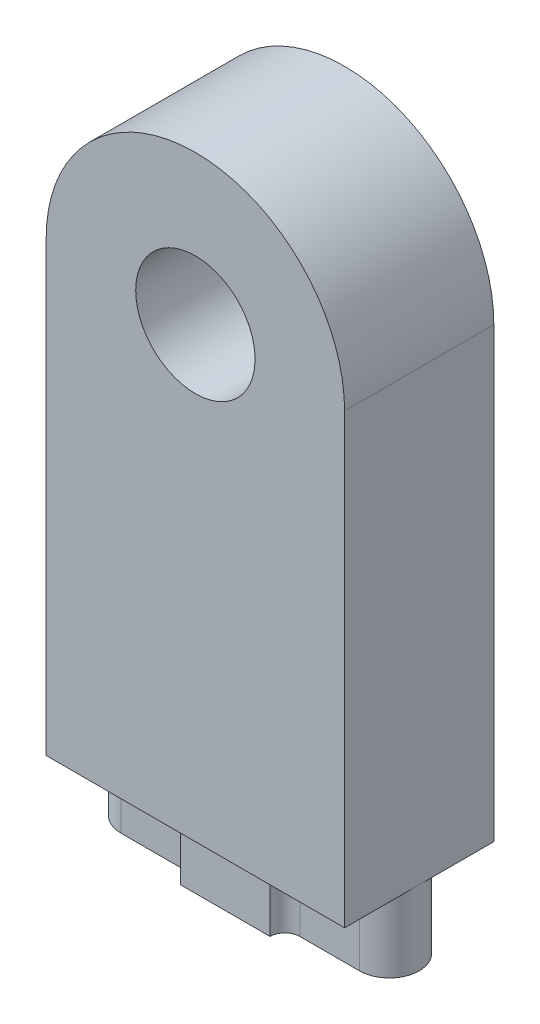
ISO-10303-21;
HEADER;
FILE_DESCRIPTION(('STEP AP214'),'2;1');
FILE_NAME('part.step','',(''),(''),'','','');
FILE_SCHEMA(('AUTOMOTIVE_DESIGN { 1 0 10303 214 1 1 1 1 }'));
ENDSEC;
DATA;
#1=APPLICATION_CONTEXT('core data for automotive mechanical design processes');
#2=APPLICATION_PROTOCOL_DEFINITION('international standard','automotive_design',2000,#1);
#3=PRODUCT_CONTEXT('',#1,'mechanical');
#4=PRODUCT('Part','Part','',(#3));
#5=PRODUCT_RELATED_PRODUCT_CATEGORY('part','',(#4));
#6=PRODUCT_DEFINITION_FORMATION('','',#4);
#7=PRODUCT_DEFINITION_CONTEXT('part definition',#1,'design');
#8=PRODUCT_DEFINITION('design','',#6,#7);
#9=PRODUCT_DEFINITION_SHAPE('','',#8);
#10=(LENGTH_UNIT() NAMED_UNIT(*) SI_UNIT(.MILLI.,.METRE.));
#11=(NAMED_UNIT(*) PLANE_ANGLE_UNIT() SI_UNIT($,.RADIAN.));
#12=(NAMED_UNIT(*) SI_UNIT($,.STERADIAN.) SOLID_ANGLE_UNIT());
#13=UNCERTAINTY_MEASURE_WITH_UNIT(LENGTH_MEASURE(1.E-05),#10,'distance_accuracy_value','');
#14=(GEOMETRIC_REPRESENTATION_CONTEXT(3) GLOBAL_UNCERTAINTY_ASSIGNED_CONTEXT((#13)) GLOBAL_UNIT_ASSIGNED_CONTEXT((#10,
#11,#12)) REPRESENTATION_CONTEXT('',''));
#15=CARTESIAN_POINT('',(0.,0.,0.));
#16=DIRECTION('',(0.,0.,1.));
#17=DIRECTION('',(1.,0.,0.));
#18=AXIS2_PLACEMENT_3D('',#15,#16,#17);
#19=CARTESIAN_POINT('',(-10.,-20.,10.));
#20=DIRECTION('',(0.,1.,0.));
#21=DIRECTION('',(0.,0.,1.));
#22=AXIS2_PLACEMENT_3D('',#19,#20,#21);
#23=PLANE('',#22);
#24=DIRECTION('',(-1.,0.,0.));
#25=VECTOR('',#24,1.);
#26=CARTESIAN_POINT('',(-1.75,-20.,7.99999999999999));
#27=LINE('',#26,#25);
#28=CARTESIAN_POINT('',(3.,-20.,7.99999999999999));
#29=VERTEX_POINT('',#28);
#30=CARTESIAN_POINT('',(-3.,-20.,8.));
#31=VERTEX_POINT('',#30);
#32=EDGE_CURVE('E289',#29,#31,#27,.T.);
#33=ORIENTED_EDGE('',*,*,#32,.F.);
#34=CARTESIAN_POINT('',(4.,-20.,8.));
#35=DIRECTION('',(0.,1.,0.));
#36=DIRECTION('',(0.,0.,1.));
#37=AXIS2_PLACEMENT_3D('',#34,#35,#36);
#38=CIRCLE('',#37,1.);
#39=CARTESIAN_POINT('',(4.,-20.,7.));
#40=VERTEX_POINT('',#39);
#41=EDGE_CURVE('E260',#29,#40,#38,.F.);
#42=ORIENTED_EDGE('',*,*,#41,.T.);
#43=DIRECTION('',(-1.,0.,0.));
#44=VECTOR('',#43,1.);
#45=CARTESIAN_POINT('',(-8.,-20.,7.));
#46=LINE('',#45,#44);
#47=CARTESIAN_POINT('',(8.,-20.,7.));
#48=VERTEX_POINT('',#47);
#49=EDGE_CURVE('E189',#48,#40,#46,.T.);
#50=ORIENTED_EDGE('',*,*,#49,.F.);
#51=CARTESIAN_POINT('',(8.,-20.,5.));
#52=DIRECTION('',(0.,-1.,0.));
#53=DIRECTION('',(0.,0.,-1.));
#54=AXIS2_PLACEMENT_3D('',#51,#52,#53);
#55=CIRCLE('',#54,2.);
#56=CARTESIAN_POINT('',(10.,-20.,5.));
#57=VERTEX_POINT('',#56);
#58=EDGE_CURVE('E205',#57,#48,#55,.T.);
#59=ORIENTED_EDGE('',*,*,#58,.F.);
#60=DIRECTION('',(0.,0.,-1.));
#61=VECTOR('',#60,1.);
#62=CARTESIAN_POINT('',(10.,-20.,10.));
#63=LINE('',#62,#61);
#64=CARTESIAN_POINT('',(10.,-20.,10.));
#65=VERTEX_POINT('',#64);
#66=EDGE_CURVE('E251',#65,#57,#63,.T.);
#67=ORIENTED_EDGE('',*,*,#66,.F.);
#68=DIRECTION('',(1.,0.,0.));
#69=VECTOR('',#68,1.);
#70=CARTESIAN_POINT('',(-10.,-20.,10.));
#71=LINE('',#70,#69);
#72=CARTESIAN_POINT('',(-10.,-20.,10.));
#73=VERTEX_POINT('',#72);
#74=EDGE_CURVE('E229',#73,#65,#71,.T.);
#75=ORIENTED_EDGE('',*,*,#74,.F.);
#76=DIRECTION('',(0.,0.,-1.));
#77=VECTOR('',#76,1.);
#78=CARTESIAN_POINT('',(-10.,-20.,10.));
#79=LINE('',#78,#77);
#80=CARTESIAN_POINT('',(-10.,-20.,5.));
#81=VERTEX_POINT('',#80);
#82=EDGE_CURVE('E255',#73,#81,#79,.T.);
#83=ORIENTED_EDGE('',*,*,#82,.T.);
#84=CARTESIAN_POINT('',(-8.,-20.,5.));
#85=DIRECTION('',(0.,-1.,0.));
#86=DIRECTION('',(0.,0.,-1.));
#87=AXIS2_PLACEMENT_3D('',#84,#85,#86);
#88=CIRCLE('',#87,2.);
#89=CARTESIAN_POINT('',(-8.,-20.,7.));
#90=VERTEX_POINT('',#89);
#91=EDGE_CURVE('E173',#90,#81,#88,.T.);
#92=ORIENTED_EDGE('',*,*,#91,.F.);
#93=CARTESIAN_POINT('',(-4.,-20.,7.));
#94=VERTEX_POINT('',#93);
#95=EDGE_CURVE('E204',#94,#90,#46,.T.);
#96=ORIENTED_EDGE('',*,*,#95,.F.);
#97=CARTESIAN_POINT('',(-4.,-20.,8.));
#98=DIRECTION('',(0.,1.,0.));
#99=DIRECTION('',(0.,0.,1.));
#100=AXIS2_PLACEMENT_3D('',#97,#98,#99);
#101=CIRCLE('',#100,1.);
#102=EDGE_CURVE('E258',#94,#31,#101,.F.);
#103=ORIENTED_EDGE('',*,*,#102,.T.);
#104=EDGE_LOOP('',(#33,#42,#50,#59,#67,#75,#83,#92,#96,#103));
#105=FACE_BOUND('',#104,.T.);
#106=ADVANCED_FACE('F32',(#105),#23,.F.);
#107=DIRECTION('',(1.,0.,0.));
#108=VECTOR('',#107,1.);
#109=CARTESIAN_POINT('',(-8.,-20.,3.));
#110=LINE('',#109,#108);
#111=CARTESIAN_POINT('',(4.,-20.,3.));
#112=VERTEX_POINT('',#111);
#113=CARTESIAN_POINT('',(8.,-20.,3.));
#114=VERTEX_POINT('',#113);
#115=EDGE_CURVE('E177',#112,#114,#110,.T.);
#116=ORIENTED_EDGE('',*,*,#115,.F.);
#117=CARTESIAN_POINT('',(4.,-20.,2.));
#118=DIRECTION('',(0.,1.,0.));
#119=DIRECTION('',(0.,0.,1.));
#120=AXIS2_PLACEMENT_3D('',#117,#118,#119);
#121=CIRCLE('',#120,1.);
#122=CARTESIAN_POINT('',(3.,-20.,1.99999999999999));
#123=VERTEX_POINT('',#122);
#124=EDGE_CURVE('E267',#112,#123,#121,.F.);
#125=ORIENTED_EDGE('',*,*,#124,.T.);
#126=DIRECTION('',(1.,0.,0.));
#127=VECTOR('',#126,1.);
#128=CARTESIAN_POINT('',(-1.75,-20.,1.99999999999999));
#129=LINE('',#128,#127);
#130=CARTESIAN_POINT('',(-3.,-20.,1.99999999999999));
#131=VERTEX_POINT('',#130);
#132=EDGE_CURVE('E168',#131,#123,#129,.T.);
#133=ORIENTED_EDGE('',*,*,#132,.F.);
#134=CARTESIAN_POINT('',(-4.,-20.,1.99999999999999));
#135=DIRECTION('',(0.,1.,0.));
#136=DIRECTION('',(0.,0.,1.));
#137=AXIS2_PLACEMENT_3D('',#134,#135,#136);
#138=CIRCLE('',#137,1.);
#139=CARTESIAN_POINT('',(-4.,-20.,3.));
#140=VERTEX_POINT('',#139);
#141=EDGE_CURVE('E265',#131,#140,#138,.F.);
#142=ORIENTED_EDGE('',*,*,#141,.T.);
#143=CARTESIAN_POINT('',(-8.,-20.,3.));
#144=VERTEX_POINT('',#143);
#145=EDGE_CURVE('E199',#144,#140,#110,.T.);
#146=ORIENTED_EDGE('',*,*,#145,.F.);
#147=EDGE_CURVE('E179',#81,#144,#88,.T.);
#148=ORIENTED_EDGE('',*,*,#147,.F.);
#149=CARTESIAN_POINT('',(-10.,-20.,0.));
#150=VERTEX_POINT('',#149);
#151=EDGE_CURVE('E254',#81,#150,#79,.T.);
#152=ORIENTED_EDGE('',*,*,#151,.T.);
#153=DIRECTION('',(1.,0.,0.));
#154=VECTOR('',#153,1.);
#155=CARTESIAN_POINT('',(-10.,-20.,0.));
#156=LINE('',#155,#154);
#157=CARTESIAN_POINT('',(10.,-20.,0.));
#158=VERTEX_POINT('',#157);
#159=EDGE_CURVE('E239',#150,#158,#156,.T.);
#160=ORIENTED_EDGE('',*,*,#159,.T.);
#161=EDGE_CURVE('E250',#57,#158,#63,.T.);
#162=ORIENTED_EDGE('',*,*,#161,.F.);
#163=EDGE_CURVE('E201',#114,#57,#55,.T.);
#164=ORIENTED_EDGE('',*,*,#163,.F.);
#165=EDGE_LOOP('',(#116,#125,#133,#142,#146,#148,#152,#160,#162,#164));
#166=FACE_BOUND('',#165,.T.);
#167=ADVANCED_FACE('F321',(#166),#23,.F.);
#168=CARTESIAN_POINT('',(-8.,-25.,3.));
#169=DIRECTION('',(0.,0.,1.));
#170=DIRECTION('',(1.,0.,0.));
#171=AXIS2_PLACEMENT_3D('',#168,#169,#170);
#172=PLANE('',#171);
#173=DIRECTION('',(1.,0.,0.));
#174=VECTOR('',#173,1.);
#175=CARTESIAN_POINT('',(-8.,-25.,3.));
#176=LINE('',#175,#174);
#177=CARTESIAN_POINT('',(4.,-25.,3.));
#178=VERTEX_POINT('',#177);
#179=CARTESIAN_POINT('',(8.,-25.,3.));
#180=VERTEX_POINT('',#179);
#181=EDGE_CURVE('E188',#178,#180,#176,.T.);
#182=ORIENTED_EDGE('',*,*,#181,.F.);
#183=DIRECTION('',(0.,-1.,0.));
#184=VECTOR('',#183,1.);
#185=CARTESIAN_POINT('',(4.,-20.,3.));
#186=LINE('',#185,#184);
#187=EDGE_CURVE('E156',#178,#112,#186,.F.);
#188=ORIENTED_EDGE('',*,*,#187,.T.);
#189=ORIENTED_EDGE('',*,*,#115,.T.);
#190=DIRECTION('',(0.,1.,0.));
#191=VECTOR('',#190,1.);
#192=CARTESIAN_POINT('',(8.,-25.,3.));
#193=LINE('',#192,#191);
#194=EDGE_CURVE('E213',#180,#114,#193,.T.);
#195=ORIENTED_EDGE('',*,*,#194,.F.);
#196=EDGE_LOOP('',(#182,#188,#189,#195));
#197=FACE_BOUND('',#196,.T.);
#198=ADVANCED_FACE('F353',(#197),#172,.F.);
#199=ORIENTED_EDGE('',*,*,#145,.T.);
#200=DIRECTION('',(0.,1.,0.));
#201=VECTOR('',#200,1.);
#202=CARTESIAN_POINT('',(-4.,-25.,3.));
#203=LINE('',#202,#201);
#204=CARTESIAN_POINT('',(-4.,-25.,3.));
#205=VERTEX_POINT('',#204);
#206=EDGE_CURVE('E53',#140,#205,#203,.F.);
#207=ORIENTED_EDGE('',*,*,#206,.T.);
#208=CARTESIAN_POINT('',(-8.,-25.,3.));
#209=VERTEX_POINT('',#208);
#210=EDGE_CURVE('E190',#209,#205,#176,.T.);
#211=ORIENTED_EDGE('',*,*,#210,.F.);
#212=DIRECTION('',(0.,1.,0.));
#213=VECTOR('',#212,1.);
#214=CARTESIAN_POINT('',(-8.,-25.,3.));
#215=LINE('',#214,#213);
#216=EDGE_CURVE('E216',#209,#144,#215,.T.);
#217=ORIENTED_EDGE('',*,*,#216,.T.);
#218=EDGE_LOOP('',(#199,#207,#211,#217));
#219=FACE_BOUND('',#218,.T.);
#220=ADVANCED_FACE('F307',(#219),#172,.F.);
#221=CARTESIAN_POINT('',(-8.,-25.,7.));
#222=DIRECTION('',(0.,0.,-1.));
#223=DIRECTION('',(-1.,0.,0.));
#224=AXIS2_PLACEMENT_3D('',#221,#222,#223);
#225=PLANE('',#224);
#226=ORIENTED_EDGE('',*,*,#49,.T.);
#227=DIRECTION('',(0.,1.,0.));
#228=VECTOR('',#227,1.);
#229=CARTESIAN_POINT('',(4.,-25.,7.));
#230=LINE('',#229,#228);
#231=CARTESIAN_POINT('',(4.,-25.,7.));
#232=VERTEX_POINT('',#231);
#233=EDGE_CURVE('E262',#40,#232,#230,.F.);
#234=ORIENTED_EDGE('',*,*,#233,.T.);
#235=DIRECTION('',(-1.,0.,0.));
#236=VECTOR('',#235,1.);
#237=CARTESIAN_POINT('',(-8.,-25.,7.));
#238=LINE('',#237,#236);
#239=CARTESIAN_POINT('',(8.,-25.,7.));
#240=VERTEX_POINT('',#239);
#241=EDGE_CURVE('E195',#240,#232,#238,.T.);
#242=ORIENTED_EDGE('',*,*,#241,.F.);
#243=DIRECTION('',(0.,1.,0.));
#244=VECTOR('',#243,1.);
#245=CARTESIAN_POINT('',(8.,-25.,7.));
#246=LINE('',#245,#244);
#247=EDGE_CURVE('E210',#240,#48,#246,.T.);
#248=ORIENTED_EDGE('',*,*,#247,.T.);
#249=EDGE_LOOP('',(#226,#234,#242,#248));
#250=FACE_BOUND('',#249,.T.);
#251=ADVANCED_FACE('F291',(#250),#225,.F.);
#252=CARTESIAN_POINT('',(-4.,-25.,7.));
#253=VERTEX_POINT('',#252);
#254=CARTESIAN_POINT('',(-8.,-25.,7.));
#255=VERTEX_POINT('',#254);
#256=EDGE_CURVE('E194',#253,#255,#238,.T.);
#257=ORIENTED_EDGE('',*,*,#256,.F.);
#258=DIRECTION('',(0.,-1.,0.));
#259=VECTOR('',#258,1.);
#260=CARTESIAN_POINT('',(-4.,-20.,7.));
#261=LINE('',#260,#259);
#262=EDGE_CURVE('E270',#253,#94,#261,.F.);
#263=ORIENTED_EDGE('',*,*,#262,.T.);
#264=ORIENTED_EDGE('',*,*,#95,.T.);
#265=DIRECTION('',(0.,1.,0.));
#266=VECTOR('',#265,1.);
#267=CARTESIAN_POINT('',(-8.,-25.,7.));
#268=LINE('',#267,#266);
#269=EDGE_CURVE('E197',#255,#90,#268,.T.);
#270=ORIENTED_EDGE('',*,*,#269,.F.);
#271=EDGE_LOOP('',(#257,#263,#264,#270));
#272=FACE_BOUND('',#271,.T.);
#273=ADVANCED_FACE('F310',(#272),#225,.F.);
#274=CARTESIAN_POINT('',(-10.,-20.,10.));
#275=DIRECTION('',(1.,0.,0.));
#276=DIRECTION('',(0.,1.,0.));
#277=AXIS2_PLACEMENT_3D('',#274,#275,#276);
#278=PLANE('',#277);
#279=DIRECTION('',(0.,-1.,0.));
#280=VECTOR('',#279,1.);
#281=CARTESIAN_POINT('',(-10.,-20.,0.));
#282=LINE('',#281,#280);
#283=CARTESIAN_POINT('',(-10.,10.,0.));
#284=VERTEX_POINT('',#283);
#285=EDGE_CURVE('E223',#284,#150,#282,.T.);
#286=ORIENTED_EDGE('',*,*,#285,.T.);
#287=ORIENTED_EDGE('',*,*,#151,.F.);
#288=ORIENTED_EDGE('',*,*,#82,.F.);
#289=DIRECTION('',(0.,-1.,0.));
#290=VECTOR('',#289,1.);
#291=CARTESIAN_POINT('',(-10.,-20.,10.));
#292=LINE('',#291,#290);
#293=CARTESIAN_POINT('',(-10.,10.,10.));
#294=VERTEX_POINT('',#293);
#295=EDGE_CURVE('E226',#294,#73,#292,.T.);
#296=ORIENTED_EDGE('',*,*,#295,.F.);
#297=DIRECTION('',(0.,0.,-1.));
#298=VECTOR('',#297,1.);
#299=CARTESIAN_POINT('',(-10.,10.,10.));
#300=LINE('',#299,#298);
#301=EDGE_CURVE('E236',#294,#284,#300,.T.);
#302=ORIENTED_EDGE('',*,*,#301,.T.);
#303=EDGE_LOOP('',(#286,#287,#288,#296,#302));
#304=FACE_BOUND('',#303,.T.);
#305=ADVANCED_FACE('F317',(#304),#278,.F.);
#306=CARTESIAN_POINT('',(10.,-20.,10.));
#307=DIRECTION('',(-1.,0.,0.));
#308=DIRECTION('',(0.,-1.,0.));
#309=AXIS2_PLACEMENT_3D('',#306,#307,#308);
#310=PLANE('',#309);
#311=DIRECTION('',(0.,1.,0.));
#312=VECTOR('',#311,1.);
#313=CARTESIAN_POINT('',(10.,-20.,0.));
#314=LINE('',#313,#312);
#315=CARTESIAN_POINT('',(10.,10.,0.));
#316=VERTEX_POINT('',#315);
#317=EDGE_CURVE('E242',#158,#316,#314,.T.);
#318=ORIENTED_EDGE('',*,*,#317,.T.);
#319=DIRECTION('',(0.,0.,-1.));
#320=VECTOR('',#319,1.);
#321=CARTESIAN_POINT('',(10.,10.,10.));
#322=LINE('',#321,#320);
#323=CARTESIAN_POINT('',(10.,10.,10.));
#324=VERTEX_POINT('',#323);
#325=EDGE_CURVE('E247',#324,#316,#322,.T.);
#326=ORIENTED_EDGE('',*,*,#325,.F.);
#327=DIRECTION('',(0.,1.,0.));
#328=VECTOR('',#327,1.);
#329=CARTESIAN_POINT('',(10.,-20.,10.));
#330=LINE('',#329,#328);
#331=EDGE_CURVE('E232',#65,#324,#330,.T.);
#332=ORIENTED_EDGE('',*,*,#331,.F.);
#333=ORIENTED_EDGE('',*,*,#66,.T.);
#334=ORIENTED_EDGE('',*,*,#161,.T.);
#335=EDGE_LOOP('',(#318,#326,#332,#333,#334));
#336=FACE_BOUND('',#335,.T.);
#337=ADVANCED_FACE('F328',(#336),#310,.F.);
#338=CARTESIAN_POINT('',(0.,10.,10.));
#339=DIRECTION('',(0.,0.,-1.));
#340=DIRECTION('',(-1.,0.,0.));
#341=AXIS2_PLACEMENT_3D('',#338,#339,#340);
#342=CYLINDRICAL_SURFACE('',#341,10.);
#343=CARTESIAN_POINT('',(0.,10.,0.));
#344=DIRECTION('',(0.,0.,1.));
#345=DIRECTION('',(-1.,0.,0.));
#346=AXIS2_PLACEMENT_3D('',#343,#344,#345);
#347=CIRCLE('',#346,10.);
#348=EDGE_CURVE('E230',#316,#284,#347,.T.);
#349=ORIENTED_EDGE('',*,*,#348,.T.);
#350=ORIENTED_EDGE('',*,*,#301,.F.);
#351=CARTESIAN_POINT('',(0.,10.,10.));
#352=DIRECTION('',(0.,0.,1.));
#353=DIRECTION('',(-1.,0.,0.));
#354=AXIS2_PLACEMENT_3D('',#351,#352,#353);
#355=CIRCLE('',#354,10.);
#356=EDGE_CURVE('E234',#324,#294,#355,.T.);
#357=ORIENTED_EDGE('',*,*,#356,.F.);
#358=ORIENTED_EDGE('',*,*,#325,.T.);
#359=EDGE_LOOP('',(#349,#350,#357,#358));
#360=FACE_BOUND('',#359,.T.);
#361=ADVANCED_FACE('F332',(#360),#342,.T.);
#362=CARTESIAN_POINT('',(0.,10.,10.));
#363=DIRECTION('',(0.,0.,-1.));
#364=DIRECTION('',(-1.,0.,0.));
#365=AXIS2_PLACEMENT_3D('',#362,#363,#364);
#366=PLANE('',#365);
#367=CARTESIAN_POINT('',(0.,10.,10.));
#368=DIRECTION('',(0.,0.,-1.));
#369=DIRECTION('',(-1.,0.,0.));
#370=AXIS2_PLACEMENT_3D('',#367,#368,#369);
#371=CIRCLE('',#370,4.);
#372=CARTESIAN_POINT('',(-4.,10.,10.));
#373=VERTEX_POINT('',#372);
#374=EDGE_CURVE('E220',#373,#373,#371,.T.);
#375=ORIENTED_EDGE('',*,*,#374,.T.);
#376=EDGE_LOOP('',(#375));
#377=FACE_BOUND('',#376,.T.);
#378=ORIENTED_EDGE('',*,*,#295,.T.);
#379=ORIENTED_EDGE('',*,*,#74,.T.);
#380=ORIENTED_EDGE('',*,*,#331,.T.);
#381=ORIENTED_EDGE('',*,*,#356,.T.);
#382=EDGE_LOOP('',(#378,#379,#380,#381));
#383=FACE_BOUND('',#382,.T.);
#384=ADVANCED_FACE('F335',(#377,#383),#366,.F.);
#385=CARTESIAN_POINT('',(0.,10.,0.));
#386=DIRECTION('',(0.,0.,-1.));
#387=DIRECTION('',(-1.,0.,0.));
#388=AXIS2_PLACEMENT_3D('',#385,#386,#387);
#389=PLANE('',#388);
#390=CARTESIAN_POINT('',(0.,10.,0.));
#391=DIRECTION('',(0.,0.,-1.));
#392=DIRECTION('',(-1.,0.,0.));
#393=AXIS2_PLACEMENT_3D('',#390,#391,#392);
#394=CIRCLE('',#393,4.);
#395=CARTESIAN_POINT('',(-4.,10.,0.));
#396=VERTEX_POINT('',#395);
#397=EDGE_CURVE('E219',#396,#396,#394,.T.);
#398=ORIENTED_EDGE('',*,*,#397,.F.);
#399=EDGE_LOOP('',(#398));
#400=FACE_BOUND('',#399,.T.);
#401=ORIENTED_EDGE('',*,*,#285,.F.);
#402=ORIENTED_EDGE('',*,*,#348,.F.);
#403=ORIENTED_EDGE('',*,*,#317,.F.);
#404=ORIENTED_EDGE('',*,*,#159,.F.);
#405=EDGE_LOOP('',(#401,#402,#403,#404));
#406=FACE_BOUND('',#405,.T.);
#407=ADVANCED_FACE('F324',(#400,#406),#389,.T.);
#408=CARTESIAN_POINT('',(0.,10.,10.));
#409=DIRECTION('',(0.,0.,-1.));
#410=DIRECTION('',(-1.,0.,0.));
#411=AXIS2_PLACEMENT_3D('',#408,#409,#410);
#412=CYLINDRICAL_SURFACE('',#411,4.);
#413=ORIENTED_EDGE('',*,*,#374,.F.);
#414=EDGE_LOOP('',(#413));
#415=FACE_BOUND('',#414,.T.);
#416=ORIENTED_EDGE('',*,*,#397,.T.);
#417=EDGE_LOOP('',(#416));
#418=FACE_BOUND('',#417,.T.);
#419=ADVANCED_FACE('F343',(#415,#418),#412,.F.);
#420=CARTESIAN_POINT('',(-8.,-25.,5.));
#421=DIRECTION('',(0.,1.,0.));
#422=DIRECTION('',(0.,0.,1.));
#423=AXIS2_PLACEMENT_3D('',#420,#421,#422);
#424=CYLINDRICAL_SURFACE('',#423,2.);
#425=ORIENTED_EDGE('',*,*,#91,.T.);
#426=ORIENTED_EDGE('',*,*,#147,.T.);
#427=ORIENTED_EDGE('',*,*,#216,.F.);
#428=CARTESIAN_POINT('',(-8.,-25.,5.));
#429=DIRECTION('',(0.,-1.,0.));
#430=DIRECTION('',(0.,0.,-1.));
#431=AXIS2_PLACEMENT_3D('',#428,#429,#430);
#432=CIRCLE('',#431,2.);
#433=EDGE_CURVE('E185',#255,#209,#432,.T.);
#434=ORIENTED_EDGE('',*,*,#433,.F.);
#435=ORIENTED_EDGE('',*,*,#269,.T.);
#436=EDGE_LOOP('',(#425,#426,#427,#434,#435));
#437=FACE_BOUND('',#436,.T.);
#438=ADVANCED_FACE('F302',(#437),#424,.T.);
#439=CARTESIAN_POINT('',(8.,-25.,5.));
#440=DIRECTION('',(0.,1.,0.));
#441=DIRECTION('',(0.,0.,1.));
#442=AXIS2_PLACEMENT_3D('',#439,#440,#441);
#443=CYLINDRICAL_SURFACE('',#442,2.);
#444=ORIENTED_EDGE('',*,*,#163,.T.);
#445=ORIENTED_EDGE('',*,*,#58,.T.);
#446=ORIENTED_EDGE('',*,*,#247,.F.);
#447=CARTESIAN_POINT('',(8.,-25.,5.));
#448=DIRECTION('',(0.,-1.,0.));
#449=DIRECTION('',(0.,0.,-1.));
#450=AXIS2_PLACEMENT_3D('',#447,#448,#449);
#451=CIRCLE('',#450,2.);
#452=EDGE_CURVE('E192',#180,#240,#451,.T.);
#453=ORIENTED_EDGE('',*,*,#452,.F.);
#454=ORIENTED_EDGE('',*,*,#194,.T.);
#455=EDGE_LOOP('',(#444,#445,#446,#453,#454));
#456=FACE_BOUND('',#455,.T.);
#457=ADVANCED_FACE('F295',(#456),#443,.T.);
#458=CARTESIAN_POINT('',(-8.,-25.,5.));
#459=DIRECTION('',(0.,-1.,0.));
#460=DIRECTION('',(0.,0.,-1.));
#461=AXIS2_PLACEMENT_3D('',#458,#459,#460);
#462=PLANE('',#461);
#463=ORIENTED_EDGE('',*,*,#210,.T.);
#464=CARTESIAN_POINT('',(-4.,-25.,1.99999999999999));
#465=DIRECTION('',(0.,-1.,0.));
#466=DIRECTION('',(0.,0.,-1.));
#467=AXIS2_PLACEMENT_3D('',#464,#465,#466);
#468=CIRCLE('',#467,1.);
#469=CARTESIAN_POINT('',(-3.,-25.,1.99999999999999));
#470=VERTEX_POINT('',#469);
#471=EDGE_CURVE('E40',#205,#470,#468,.F.);
#472=ORIENTED_EDGE('',*,*,#471,.T.);
#473=DIRECTION('',(1.,0.,0.));
#474=VECTOR('',#473,1.);
#475=CARTESIAN_POINT('',(1.75,-25.,1.99999999999999));
#476=LINE('',#475,#474);
#477=CARTESIAN_POINT('',(3.,-25.,1.99999999999999));
#478=VERTEX_POINT('',#477);
#479=EDGE_CURVE('E161',#470,#478,#476,.T.);
#480=ORIENTED_EDGE('',*,*,#479,.T.);
#481=CARTESIAN_POINT('',(4.,-25.,2.));
#482=DIRECTION('',(0.,-1.,0.));
#483=DIRECTION('',(0.,0.,-1.));
#484=AXIS2_PLACEMENT_3D('',#481,#482,#483);
#485=CIRCLE('',#484,1.);
#486=EDGE_CURVE('E150',#478,#178,#485,.F.);
#487=ORIENTED_EDGE('',*,*,#486,.T.);
#488=ORIENTED_EDGE('',*,*,#181,.T.);
#489=ORIENTED_EDGE('',*,*,#452,.T.);
#490=ORIENTED_EDGE('',*,*,#241,.T.);
#491=CARTESIAN_POINT('',(4.,-25.,8.));
#492=DIRECTION('',(0.,-1.,0.));
#493=DIRECTION('',(0.,0.,-1.));
#494=AXIS2_PLACEMENT_3D('',#491,#492,#493);
#495=CIRCLE('',#494,1.);
#496=CARTESIAN_POINT('',(3.,-25.,7.99999999999999));
#497=VERTEX_POINT('',#496);
#498=EDGE_CURVE('E158',#232,#497,#495,.F.);
#499=ORIENTED_EDGE('',*,*,#498,.T.);
#500=DIRECTION('',(-1.,0.,0.));
#501=VECTOR('',#500,1.);
#502=CARTESIAN_POINT('',(3.,-25.,7.99999999999999));
#503=LINE('',#502,#501);
#504=CARTESIAN_POINT('',(-3.,-25.,8.));
#505=VERTEX_POINT('',#504);
#506=EDGE_CURVE('E167',#497,#505,#503,.T.);
#507=ORIENTED_EDGE('',*,*,#506,.T.);
#508=CARTESIAN_POINT('',(-4.,-25.,8.));
#509=DIRECTION('',(0.,-1.,0.));
#510=DIRECTION('',(0.,0.,-1.));
#511=AXIS2_PLACEMENT_3D('',#508,#509,#510);
#512=CIRCLE('',#511,1.);
#513=EDGE_CURVE('E11',#505,#253,#512,.F.);
#514=ORIENTED_EDGE('',*,*,#513,.T.);
#515=ORIENTED_EDGE('',*,*,#256,.T.);
#516=ORIENTED_EDGE('',*,*,#433,.T.);
#517=EDGE_LOOP('',(#463,#472,#480,#487,#488,#489,#490,#499,#507,#514,#515,#516));
#518=FACE_BOUND('',#517,.T.);
#519=ADVANCED_FACE('F162',(#518),#462,.T.);
#520=CARTESIAN_POINT('',(-1.75,-25.,7.99999999999999));
#521=DIRECTION('',(0.,0.,-1.));
#522=DIRECTION('',(-1.,0.,0.));
#523=AXIS2_PLACEMENT_3D('',#520,#521,#522);
#524=PLANE('',#523);
#525=ORIENTED_EDGE('',*,*,#32,.T.);
#526=DIRECTION('',(0.,1.,0.));
#527=VECTOR('',#526,1.);
#528=CARTESIAN_POINT('',(-3.,-25.,8.));
#529=LINE('',#528,#527);
#530=EDGE_CURVE('E181',#505,#31,#529,.T.);
#531=ORIENTED_EDGE('',*,*,#530,.F.);
#532=ORIENTED_EDGE('',*,*,#506,.F.);
#533=DIRECTION('',(0.,1.,0.));
#534=VECTOR('',#533,1.);
#535=CARTESIAN_POINT('',(3.,-25.,7.99999999999999));
#536=LINE('',#535,#534);
#537=EDGE_CURVE('E174',#497,#29,#536,.T.);
#538=ORIENTED_EDGE('',*,*,#537,.T.);
#539=EDGE_LOOP('',(#525,#531,#532,#538));
#540=FACE_BOUND('',#539,.T.);
#541=ADVANCED_FACE('F281',(#540),#524,.F.);
#542=CARTESIAN_POINT('',(-1.75,-25.,1.99999999999999));
#543=DIRECTION('',(0.,0.,1.));
#544=DIRECTION('',(1.,0.,0.));
#545=AXIS2_PLACEMENT_3D('',#542,#543,#544);
#546=PLANE('',#545);
#547=ORIENTED_EDGE('',*,*,#132,.T.);
#548=DIRECTION('',(0.,1.,0.));
#549=VECTOR('',#548,1.);
#550=CARTESIAN_POINT('',(3.,-25.,1.99999999999999));
#551=LINE('',#550,#549);
#552=EDGE_CURVE('E155',#478,#123,#551,.T.);
#553=ORIENTED_EDGE('',*,*,#552,.F.);
#554=ORIENTED_EDGE('',*,*,#479,.F.);
#555=DIRECTION('',(0.,1.,0.));
#556=VECTOR('',#555,1.);
#557=CARTESIAN_POINT('',(-3.,-25.,1.99999999999999));
#558=LINE('',#557,#556);
#559=EDGE_CURVE('E284',#470,#131,#558,.T.);
#560=ORIENTED_EDGE('',*,*,#559,.T.);
#561=EDGE_LOOP('',(#547,#553,#554,#560));
#562=FACE_BOUND('',#561,.T.);
#563=ADVANCED_FACE('F171',(#562),#546,.F.);
#564=CARTESIAN_POINT('',(4.,-25.,8.));
#565=DIRECTION('',(0.,-1.,0.));
#566=DIRECTION('',(0.,0.,-1.));
#567=AXIS2_PLACEMENT_3D('',#564,#565,#566);
#568=CYLINDRICAL_SURFACE('',#567,1.);
#569=ORIENTED_EDGE('',*,*,#498,.F.);
#570=ORIENTED_EDGE('',*,*,#233,.F.);
#571=ORIENTED_EDGE('',*,*,#41,.F.);
#572=ORIENTED_EDGE('',*,*,#537,.F.);
#573=EDGE_LOOP('',(#569,#570,#571,#572));
#574=FACE_BOUND('',#573,.T.);
#575=ADVANCED_FACE('F286',(#574),#568,.F.);
#576=CARTESIAN_POINT('',(4.,-25.,2.));
#577=DIRECTION('',(0.,1.,0.));
#578=DIRECTION('',(0.,0.,1.));
#579=AXIS2_PLACEMENT_3D('',#576,#577,#578);
#580=CYLINDRICAL_SURFACE('',#579,1.);
#581=ORIENTED_EDGE('',*,*,#124,.F.);
#582=ORIENTED_EDGE('',*,*,#187,.F.);
#583=ORIENTED_EDGE('',*,*,#486,.F.);
#584=ORIENTED_EDGE('',*,*,#552,.T.);
#585=EDGE_LOOP('',(#581,#582,#583,#584));
#586=FACE_BOUND('',#585,.T.);
#587=ADVANCED_FACE('F153',(#586),#580,.F.);
#588=CARTESIAN_POINT('',(-4.,-25.,1.99999999999999));
#589=DIRECTION('',(0.,-1.,0.));
#590=DIRECTION('',(0.,0.,-1.));
#591=AXIS2_PLACEMENT_3D('',#588,#589,#590);
#592=CYLINDRICAL_SURFACE('',#591,1.);
#593=ORIENTED_EDGE('',*,*,#471,.F.);
#594=ORIENTED_EDGE('',*,*,#206,.F.);
#595=ORIENTED_EDGE('',*,*,#141,.F.);
#596=ORIENTED_EDGE('',*,*,#559,.F.);
#597=EDGE_LOOP('',(#593,#594,#595,#596));
#598=FACE_BOUND('',#597,.T.);
#599=ADVANCED_FACE('F361',(#598),#592,.F.);
#600=CARTESIAN_POINT('',(-4.,-25.,8.));
#601=DIRECTION('',(0.,1.,0.));
#602=DIRECTION('',(0.,0.,1.));
#603=AXIS2_PLACEMENT_3D('',#600,#601,#602);
#604=CYLINDRICAL_SURFACE('',#603,1.);
#605=ORIENTED_EDGE('',*,*,#102,.F.);
#606=ORIENTED_EDGE('',*,*,#262,.F.);
#607=ORIENTED_EDGE('',*,*,#513,.F.);
#608=ORIENTED_EDGE('',*,*,#530,.T.);
#609=EDGE_LOOP('',(#605,#606,#607,#608));
#610=FACE_BOUND('',#609,.T.);
#611=ADVANCED_FACE('F34',(#610),#604,.F.);
#612=CLOSED_SHELL('',(#106,#167,#198,#220,#251,#273,#305,#337,#361,#384,#407,#419,#438,#457,
#519,#541,#563,#575,#587,#599,#611));
#613=MANIFOLD_SOLID_BREP('B2',#612);
#614=ADVANCED_BREP_SHAPE_REPRESENTATION('',(#18,#613),#14);
#615=SHAPE_DEFINITION_REPRESENTATION(#9,#614);
ENDSEC;
END-ISO-10303-21;
